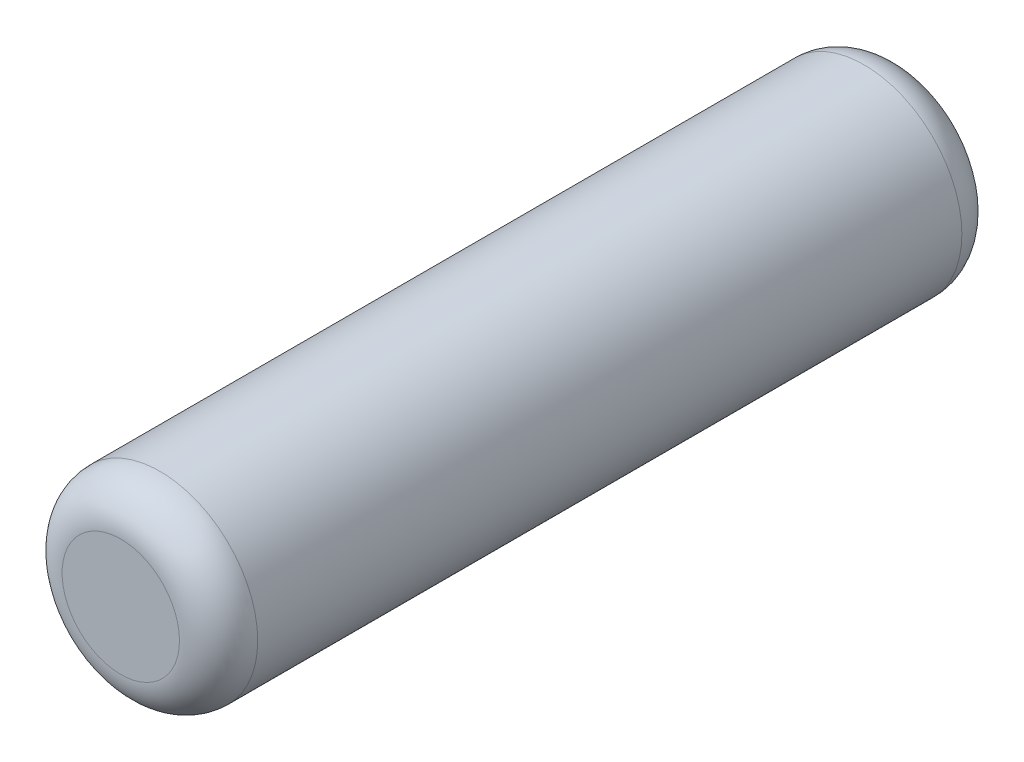
ISO-10303-21;
HEADER;
FILE_DESCRIPTION(('STEP AP214'),'2;1');
FILE_NAME('part.step','',(''),(''),'','','');
FILE_SCHEMA(('AUTOMOTIVE_DESIGN { 1 0 10303 214 1 1 1 1 }'));
ENDSEC;
DATA;
#1=APPLICATION_CONTEXT('core data for automotive mechanical design processes');
#2=APPLICATION_PROTOCOL_DEFINITION('international standard','automotive_design',2000,#1);
#3=PRODUCT_CONTEXT('',#1,'mechanical');
#4=PRODUCT('Part','Part','',(#3));
#5=PRODUCT_RELATED_PRODUCT_CATEGORY('part','',(#4));
#6=PRODUCT_DEFINITION_FORMATION('','',#4);
#7=PRODUCT_DEFINITION_CONTEXT('part definition',#1,'design');
#8=PRODUCT_DEFINITION('design','',#6,#7);
#9=PRODUCT_DEFINITION_SHAPE('','',#8);
#10=(LENGTH_UNIT() NAMED_UNIT(*) SI_UNIT(.MILLI.,.METRE.));
#11=(NAMED_UNIT(*) PLANE_ANGLE_UNIT() SI_UNIT($,.RADIAN.));
#12=(NAMED_UNIT(*) SI_UNIT($,.STERADIAN.) SOLID_ANGLE_UNIT());
#13=UNCERTAINTY_MEASURE_WITH_UNIT(LENGTH_MEASURE(1.E-05),#10,'distance_accuracy_value','');
#14=(GEOMETRIC_REPRESENTATION_CONTEXT(3) GLOBAL_UNCERTAINTY_ASSIGNED_CONTEXT((#13)) GLOBAL_UNIT_ASSIGNED_CONTEXT((#10,
#11,#12)) REPRESENTATION_CONTEXT('',''));
#15=CARTESIAN_POINT('',(0.,0.,0.));
#16=DIRECTION('',(0.,0.,1.));
#17=DIRECTION('',(1.,0.,0.));
#18=AXIS2_PLACEMENT_3D('',#15,#16,#17);
#19=CARTESIAN_POINT('',(0.,0.,10.));
#20=DIRECTION('',(0.,0.,-1.));
#21=DIRECTION('',(-1.,0.,0.));
#22=AXIS2_PLACEMENT_3D('',#19,#20,#21);
#23=CYLINDRICAL_SURFACE('',#22,2.5);
#24=CARTESIAN_POINT('',(0.,0.,-9.));
#25=DIRECTION('',(0.,0.,1.));
#26=DIRECTION('',(1.,0.,0.));
#27=AXIS2_PLACEMENT_3D('',#24,#25,#26);
#28=CIRCLE('',#27,2.5);
#29=CARTESIAN_POINT('',(2.5,0.,-9.));
#30=VERTEX_POINT('',#29);
#31=EDGE_CURVE('E44',#30,#30,#28,.T.);
#32=ORIENTED_EDGE('',*,*,#31,.T.);
#33=EDGE_LOOP('',(#32));
#34=FACE_BOUND('',#33,.T.);
#35=CARTESIAN_POINT('',(0.,0.,9.));
#36=DIRECTION('',(0.,0.,1.));
#37=DIRECTION('',(1.,0.,0.));
#38=AXIS2_PLACEMENT_3D('',#35,#36,#37);
#39=CIRCLE('',#38,2.5);
#40=CARTESIAN_POINT('',(2.5,0.,9.));
#41=VERTEX_POINT('',#40);
#42=EDGE_CURVE('E48',#41,#41,#39,.F.);
#43=ORIENTED_EDGE('',*,*,#42,.T.);
#44=EDGE_LOOP('',(#43));
#45=FACE_BOUND('',#44,.T.);
#46=ADVANCED_FACE('F33',(#34,#45),#23,.T.);
#47=CARTESIAN_POINT('',(0.,0.,10.));
#48=DIRECTION('',(0.,0.,1.));
#49=DIRECTION('',(1.,0.,0.));
#50=AXIS2_PLACEMENT_3D('',#47,#48,#49);
#51=PLANE('',#50);
#52=CARTESIAN_POINT('',(0.,0.,10.));
#53=DIRECTION('',(0.,0.,1.));
#54=DIRECTION('',(1.,0.,0.));
#55=AXIS2_PLACEMENT_3D('',#52,#53,#54);
#56=CIRCLE('',#55,1.5);
#57=CARTESIAN_POINT('',(1.5,0.,10.));
#58=VERTEX_POINT('',#57);
#59=EDGE_CURVE('E10',#58,#58,#56,.T.);
#60=ORIENTED_EDGE('',*,*,#59,.T.);
#61=EDGE_LOOP('',(#60));
#62=FACE_BOUND('',#61,.T.);
#63=ADVANCED_FACE('F64',(#62),#51,.T.);
#64=CARTESIAN_POINT('',(0.,0.,-10.));
#65=DIRECTION('',(0.,0.,1.));
#66=DIRECTION('',(1.,0.,0.));
#67=AXIS2_PLACEMENT_3D('',#64,#65,#66);
#68=PLANE('',#67);
#69=CARTESIAN_POINT('',(0.,0.,-10.));
#70=DIRECTION('',(0.,0.,1.));
#71=DIRECTION('',(1.,0.,0.));
#72=AXIS2_PLACEMENT_3D('',#69,#70,#71);
#73=CIRCLE('',#72,1.5);
#74=CARTESIAN_POINT('',(1.5,0.,-10.));
#75=VERTEX_POINT('',#74);
#76=EDGE_CURVE('E40',#75,#75,#73,.F.);
#77=ORIENTED_EDGE('',*,*,#76,.T.);
#78=EDGE_LOOP('',(#77));
#79=FACE_BOUND('',#78,.T.);
#80=ADVANCED_FACE('F61',(#79),#68,.F.);
#81=CARTESIAN_POINT('',(0.,0.,-9.));
#82=DIRECTION('',(0.,0.,1.));
#83=DIRECTION('',(1.,0.,0.));
#84=AXIS2_PLACEMENT_3D('',#81,#82,#83);
#85=TOROIDAL_SURFACE('',#84,1.5,1.);
#86=ORIENTED_EDGE('',*,*,#76,.F.);
#87=EDGE_LOOP('',(#86));
#88=FACE_BOUND('',#87,.T.);
#89=ORIENTED_EDGE('',*,*,#31,.F.);
#90=EDGE_LOOP('',(#89));
#91=FACE_BOUND('',#90,.T.);
#92=ADVANCED_FACE('F57',(#88,#91),#85,.T.);
#93=CARTESIAN_POINT('',(0.,0.,9.));
#94=DIRECTION('',(0.,0.,1.));
#95=DIRECTION('',(1.,0.,0.));
#96=AXIS2_PLACEMENT_3D('',#93,#94,#95);
#97=TOROIDAL_SURFACE('',#96,1.5,1.);
#98=ORIENTED_EDGE('',*,*,#42,.F.);
#99=EDGE_LOOP('',(#98));
#100=FACE_BOUND('',#99,.T.);
#101=ORIENTED_EDGE('',*,*,#59,.F.);
#102=EDGE_LOOP('',(#101));
#103=FACE_BOUND('',#102,.T.);
#104=ADVANCED_FACE('F35',(#100,#103),#97,.T.);
#105=CLOSED_SHELL('',(#46,#63,#80,#92,#104));
#106=MANIFOLD_SOLID_BREP('B2',#105);
#107=ADVANCED_BREP_SHAPE_REPRESENTATION('',(#18,#106),#14);
#108=SHAPE_DEFINITION_REPRESENTATION(#9,#107);
ENDSEC;
END-ISO-10303-21;
